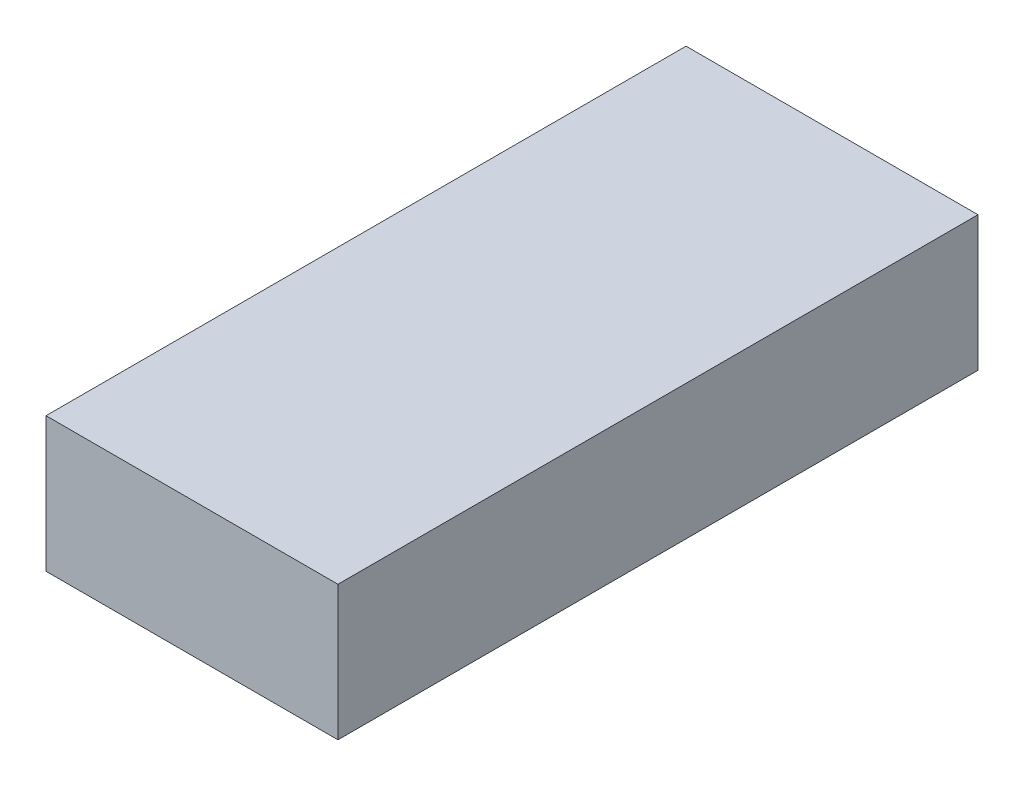
ISO-10303-21;
HEADER;
FILE_DESCRIPTION(('STEP AP214'),'2;1');
FILE_NAME('part.step','',(''),(''),'','','');
FILE_SCHEMA(('AUTOMOTIVE_DESIGN { 1 0 10303 214 1 1 1 1 }'));
ENDSEC;
DATA;
#1=APPLICATION_CONTEXT('core data for automotive mechanical design processes');
#2=APPLICATION_PROTOCOL_DEFINITION('international standard','automotive_design',2000,#1);
#3=PRODUCT_CONTEXT('',#1,'mechanical');
#4=PRODUCT('Part','Part','',(#3));
#5=PRODUCT_RELATED_PRODUCT_CATEGORY('part','',(#4));
#6=PRODUCT_DEFINITION_FORMATION('','',#4);
#7=PRODUCT_DEFINITION_CONTEXT('part definition',#1,'design');
#8=PRODUCT_DEFINITION('design','',#6,#7);
#9=PRODUCT_DEFINITION_SHAPE('','',#8);
#10=(LENGTH_UNIT() NAMED_UNIT(*) SI_UNIT(.MILLI.,.METRE.));
#11=(NAMED_UNIT(*) PLANE_ANGLE_UNIT() SI_UNIT($,.RADIAN.));
#12=(NAMED_UNIT(*) SI_UNIT($,.STERADIAN.) SOLID_ANGLE_UNIT());
#13=UNCERTAINTY_MEASURE_WITH_UNIT(LENGTH_MEASURE(1.E-05),#10,'distance_accuracy_value','');
#14=(GEOMETRIC_REPRESENTATION_CONTEXT(3) GLOBAL_UNCERTAINTY_ASSIGNED_CONTEXT((#13)) GLOBAL_UNIT_ASSIGNED_CONTEXT((#10,
#11,#12)) REPRESENTATION_CONTEXT('',''));
#15=CARTESIAN_POINT('',(0.,0.,0.));
#16=DIRECTION('',(0.,0.,1.));
#17=DIRECTION('',(1.,0.,0.));
#18=AXIS2_PLACEMENT_3D('',#15,#16,#17);
#19=CARTESIAN_POINT('',(0.,0.,57.));
#20=DIRECTION('',(1.,0.,0.));
#21=DIRECTION('',(0.,0.,-1.));
#22=AXIS2_PLACEMENT_3D('',#19,#20,#21);
#23=PLANE('',#22);
#24=DIRECTION('',(0.,-1.,0.));
#25=VECTOR('',#24,1.);
#26=CARTESIAN_POINT('',(0.,0.,0.));
#27=LINE('',#26,#25);
#28=CARTESIAN_POINT('',(0.,12.,0.));
#29=VERTEX_POINT('',#28);
#30=CARTESIAN_POINT('',(0.,0.,0.));
#31=VERTEX_POINT('',#30);
#32=EDGE_CURVE('E97',#29,#31,#27,.T.);
#33=ORIENTED_EDGE('',*,*,#32,.T.);
#34=DIRECTION('',(0.,0.,-1.));
#35=VECTOR('',#34,1.);
#36=CARTESIAN_POINT('',(0.,0.,57.));
#37=LINE('',#36,#35);
#38=CARTESIAN_POINT('',(0.,0.,57.));
#39=VERTEX_POINT('',#38);
#40=EDGE_CURVE('E11',#39,#31,#37,.T.);
#41=ORIENTED_EDGE('',*,*,#40,.F.);
#42=DIRECTION('',(0.,-1.,0.));
#43=VECTOR('',#42,1.);
#44=CARTESIAN_POINT('',(0.,0.,57.));
#45=LINE('',#44,#43);
#46=CARTESIAN_POINT('',(0.,12.,57.));
#47=VERTEX_POINT('',#46);
#48=EDGE_CURVE('E85',#47,#39,#45,.T.);
#49=ORIENTED_EDGE('',*,*,#48,.F.);
#50=DIRECTION('',(0.,0.,-1.));
#51=VECTOR('',#50,1.);
#52=CARTESIAN_POINT('',(0.,12.,57.));
#53=LINE('',#52,#51);
#54=EDGE_CURVE('E93',#47,#29,#53,.T.);
#55=ORIENTED_EDGE('',*,*,#54,.T.);
#56=EDGE_LOOP('',(#33,#41,#49,#55));
#57=FACE_BOUND('',#56,.T.);
#58=ADVANCED_FACE('F34',(#57),#23,.F.);
#59=CARTESIAN_POINT('',(0.,0.,57.));
#60=DIRECTION('',(0.,1.,0.));
#61=DIRECTION('',(0.,0.,1.));
#62=AXIS2_PLACEMENT_3D('',#59,#60,#61);
#63=PLANE('',#62);
#64=DIRECTION('',(1.,0.,0.));
#65=VECTOR('',#64,1.);
#66=CARTESIAN_POINT('',(0.,0.,0.));
#67=LINE('',#66,#65);
#68=CARTESIAN_POINT('',(26.,0.,0.));
#69=VERTEX_POINT('',#68);
#70=EDGE_CURVE('E89',#31,#69,#67,.T.);
#71=ORIENTED_EDGE('',*,*,#70,.T.);
#72=DIRECTION('',(0.,0.,-1.));
#73=VECTOR('',#72,1.);
#74=CARTESIAN_POINT('',(26.,0.,57.));
#75=LINE('',#74,#73);
#76=CARTESIAN_POINT('',(26.,0.,57.));
#77=VERTEX_POINT('',#76);
#78=EDGE_CURVE('E42',#77,#69,#75,.T.);
#79=ORIENTED_EDGE('',*,*,#78,.F.);
#80=DIRECTION('',(1.,0.,0.));
#81=VECTOR('',#80,1.);
#82=CARTESIAN_POINT('',(0.,0.,57.));
#83=LINE('',#82,#81);
#84=EDGE_CURVE('E80',#39,#77,#83,.T.);
#85=ORIENTED_EDGE('',*,*,#84,.F.);
#86=ORIENTED_EDGE('',*,*,#40,.T.);
#87=EDGE_LOOP('',(#71,#79,#85,#86));
#88=FACE_BOUND('',#87,.T.);
#89=ADVANCED_FACE('F88',(#88),#63,.F.);
#90=CARTESIAN_POINT('',(26.,0.,57.));
#91=DIRECTION('',(-1.,0.,0.));
#92=DIRECTION('',(0.,0.,1.));
#93=AXIS2_PLACEMENT_3D('',#90,#91,#92);
#94=PLANE('',#93);
#95=DIRECTION('',(0.,1.,0.));
#96=VECTOR('',#95,1.);
#97=CARTESIAN_POINT('',(26.,0.,0.));
#98=LINE('',#97,#96);
#99=CARTESIAN_POINT('',(26.,12.,0.));
#100=VERTEX_POINT('',#99);
#101=EDGE_CURVE('E67',#69,#100,#98,.T.);
#102=ORIENTED_EDGE('',*,*,#101,.T.);
#103=DIRECTION('',(0.,0.,-1.));
#104=VECTOR('',#103,1.);
#105=CARTESIAN_POINT('',(26.,12.,57.));
#106=LINE('',#105,#104);
#107=CARTESIAN_POINT('',(26.,12.,57.));
#108=VERTEX_POINT('',#107);
#109=EDGE_CURVE('E90',#108,#100,#106,.T.);
#110=ORIENTED_EDGE('',*,*,#109,.F.);
#111=DIRECTION('',(0.,1.,0.));
#112=VECTOR('',#111,1.);
#113=CARTESIAN_POINT('',(26.,0.,57.));
#114=LINE('',#113,#112);
#115=EDGE_CURVE('E83',#77,#108,#114,.T.);
#116=ORIENTED_EDGE('',*,*,#115,.F.);
#117=ORIENTED_EDGE('',*,*,#78,.T.);
#118=EDGE_LOOP('',(#102,#110,#116,#117));
#119=FACE_BOUND('',#118,.T.);
#120=ADVANCED_FACE('F91',(#119),#94,.F.);
#121=CARTESIAN_POINT('',(0.,12.,57.));
#122=DIRECTION('',(0.,-1.,0.));
#123=DIRECTION('',(0.,0.,-1.));
#124=AXIS2_PLACEMENT_3D('',#121,#122,#123);
#125=PLANE('',#124);
#126=DIRECTION('',(-1.,0.,0.));
#127=VECTOR('',#126,1.);
#128=CARTESIAN_POINT('',(0.,12.,0.));
#129=LINE('',#128,#127);
#130=EDGE_CURVE('E73',#100,#29,#129,.T.);
#131=ORIENTED_EDGE('',*,*,#130,.T.);
#132=ORIENTED_EDGE('',*,*,#54,.F.);
#133=DIRECTION('',(-1.,0.,0.));
#134=VECTOR('',#133,1.);
#135=CARTESIAN_POINT('',(0.,12.,57.));
#136=LINE('',#135,#134);
#137=EDGE_CURVE('E50',#108,#47,#136,.T.);
#138=ORIENTED_EDGE('',*,*,#137,.F.);
#139=ORIENTED_EDGE('',*,*,#109,.T.);
#140=EDGE_LOOP('',(#131,#132,#138,#139));
#141=FACE_BOUND('',#140,.T.);
#142=ADVANCED_FACE('F104',(#141),#125,.F.);
#143=CARTESIAN_POINT('',(0.,0.,57.));
#144=DIRECTION('',(0.,0.,-1.));
#145=DIRECTION('',(-1.,0.,0.));
#146=AXIS2_PLACEMENT_3D('',#143,#144,#145);
#147=PLANE('',#146);
#148=ORIENTED_EDGE('',*,*,#48,.T.);
#149=ORIENTED_EDGE('',*,*,#84,.T.);
#150=ORIENTED_EDGE('',*,*,#115,.T.);
#151=ORIENTED_EDGE('',*,*,#137,.T.);
#152=EDGE_LOOP('',(#148,#149,#150,#151));
#153=FACE_BOUND('',#152,.T.);
#154=ADVANCED_FACE('F81',(#153),#147,.F.);
#155=CARTESIAN_POINT('',(0.,0.,0.));
#156=DIRECTION('',(0.,0.,-1.));
#157=DIRECTION('',(-1.,0.,0.));
#158=AXIS2_PLACEMENT_3D('',#155,#156,#157);
#159=PLANE('',#158);
#160=ORIENTED_EDGE('',*,*,#32,.F.);
#161=ORIENTED_EDGE('',*,*,#130,.F.);
#162=ORIENTED_EDGE('',*,*,#101,.F.);
#163=ORIENTED_EDGE('',*,*,#70,.F.);
#164=EDGE_LOOP('',(#160,#161,#162,#163));
#165=FACE_BOUND('',#164,.T.);
#166=ADVANCED_FACE('F107',(#165),#159,.T.);
#167=CLOSED_SHELL('',(#58,#89,#120,#142,#154,#166));
#168=MANIFOLD_SOLID_BREP('B2',#167);
#169=ADVANCED_BREP_SHAPE_REPRESENTATION('',(#18,#168),#14);
#170=SHAPE_DEFINITION_REPRESENTATION(#9,#169);
ENDSEC;
END-ISO-10303-21;
